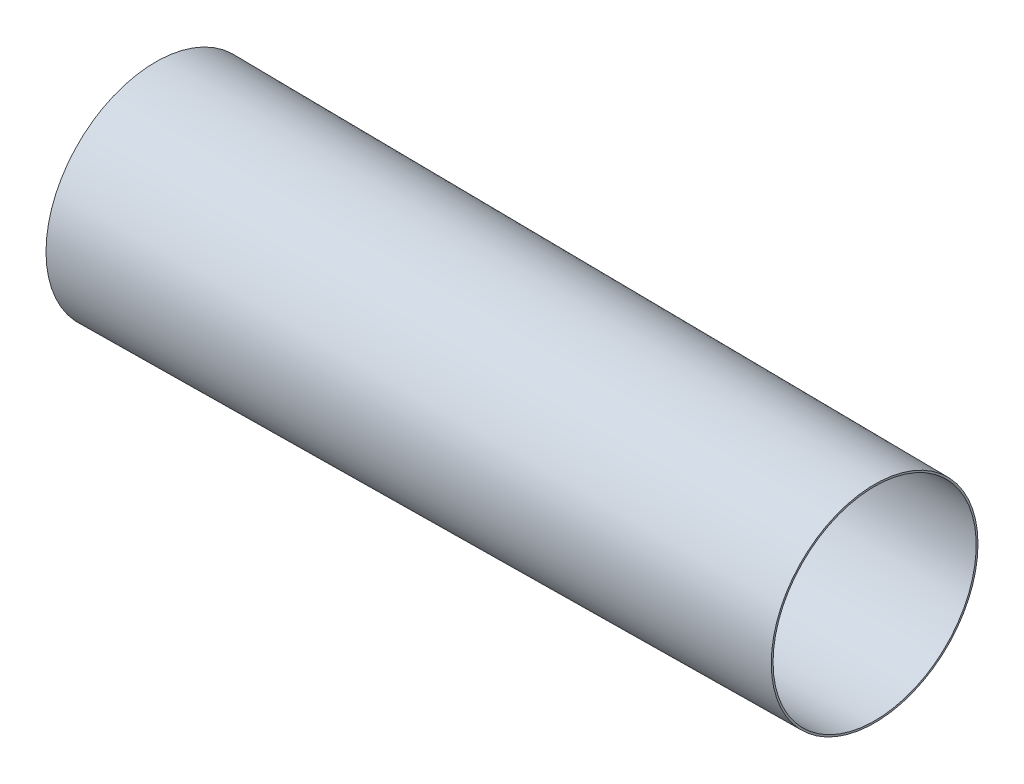
ISO-10303-21;
HEADER;
FILE_DESCRIPTION(('STEP AP214'),'2;1');
FILE_NAME('part.step','',(''),(''),'','','');
FILE_SCHEMA(('AUTOMOTIVE_DESIGN { 1 0 10303 214 1 1 1 1 }'));
ENDSEC;
DATA;
#1=APPLICATION_CONTEXT('core data for automotive mechanical design processes');
#2=APPLICATION_PROTOCOL_DEFINITION('international standard','automotive_design',2000,#1);
#3=PRODUCT_CONTEXT('',#1,'mechanical');
#4=PRODUCT('Part','Part','',(#3));
#5=PRODUCT_RELATED_PRODUCT_CATEGORY('part','',(#4));
#6=PRODUCT_DEFINITION_FORMATION('','',#4);
#7=PRODUCT_DEFINITION_CONTEXT('part definition',#1,'design');
#8=PRODUCT_DEFINITION('design','',#6,#7);
#9=PRODUCT_DEFINITION_SHAPE('','',#8);
#10=(LENGTH_UNIT() NAMED_UNIT(*) SI_UNIT(.MILLI.,.METRE.));
#11=(NAMED_UNIT(*) PLANE_ANGLE_UNIT() SI_UNIT($,.RADIAN.));
#12=(NAMED_UNIT(*) SI_UNIT($,.STERADIAN.) SOLID_ANGLE_UNIT());
#13=UNCERTAINTY_MEASURE_WITH_UNIT(LENGTH_MEASURE(1.E-05),#10,'distance_accuracy_value','');
#14=(GEOMETRIC_REPRESENTATION_CONTEXT(3) GLOBAL_UNCERTAINTY_ASSIGNED_CONTEXT((#13)) GLOBAL_UNIT_ASSIGNED_CONTEXT((#10,
#11,#12)) REPRESENTATION_CONTEXT('',''));
#15=CARTESIAN_POINT('',(0.,0.,0.));
#16=DIRECTION('',(0.,0.,1.));
#17=DIRECTION('',(1.,0.,0.));
#18=AXIS2_PLACEMENT_3D('',#15,#16,#17);
#19=CARTESIAN_POINT('',(0.,0.,-61.));
#20=DIRECTION('',(1.,0.,0.));
#21=DIRECTION('',(0.,0.,-1.));
#22=AXIS2_PLACEMENT_3D('',#19,#20,#21);
#23=PLANE('',#22);
#24=CARTESIAN_POINT('',(0.,0.,0.));
#25=DIRECTION('',(-1.,0.,0.));
#26=DIRECTION('',(0.,0.,1.));
#27=AXIS2_PLACEMENT_3D('',#24,#25,#26);
#28=CIRCLE('',#27,60.);
#29=CARTESIAN_POINT('',(0.,0.,60.));
#30=VERTEX_POINT('',#29);
#31=EDGE_CURVE('E12',#30,#30,#28,.T.);
#32=ORIENTED_EDGE('',*,*,#31,.F.);
#33=EDGE_LOOP('',(#32));
#34=FACE_BOUND('',#33,.T.);
#35=CARTESIAN_POINT('',(0.,0.,0.));
#36=DIRECTION('',(-1.,0.,0.));
#37=DIRECTION('',(0.,0.,1.));
#38=AXIS2_PLACEMENT_3D('',#35,#36,#37);
#39=CIRCLE('',#38,61.);
#40=CARTESIAN_POINT('',(0.,0.,61.));
#41=VERTEX_POINT('',#40);
#42=EDGE_CURVE('E66',#41,#41,#39,.T.);
#43=ORIENTED_EDGE('',*,*,#42,.T.);
#44=EDGE_LOOP('',(#43));
#45=FACE_BOUND('',#44,.T.);
#46=ADVANCED_FACE('F49',(#34,#45),#23,.F.);
#47=CARTESIAN_POINT('',(0.,0.,0.));
#48=DIRECTION('',(-1.,0.,0.));
#49=DIRECTION('',(0.,0.,1.));
#50=AXIS2_PLACEMENT_3D('',#47,#48,#49);
#51=CONICAL_SURFACE('',#50,60.,0.00872664625997478);
#52=CARTESIAN_POINT('',(400.,0.,0.));
#53=DIRECTION('',(-1.,0.,0.));
#54=DIRECTION('',(0.,0.,1.));
#55=AXIS2_PLACEMENT_3D('',#52,#53,#54);
#56=CIRCLE('',#55,56.5092528836952);
#57=CARTESIAN_POINT('',(400.,0.,56.5092528836952));
#58=VERTEX_POINT('',#57);
#59=EDGE_CURVE('E56',#58,#58,#56,.T.);
#60=ORIENTED_EDGE('',*,*,#59,.F.);
#61=EDGE_LOOP('',(#60));
#62=FACE_BOUND('',#61,.T.);
#63=ORIENTED_EDGE('',*,*,#31,.T.);
#64=EDGE_LOOP('',(#63));
#65=FACE_BOUND('',#64,.T.);
#66=ADVANCED_FACE('F82',(#62,#65),#51,.F.);
#67=CARTESIAN_POINT('',(400.,0.,-56.5092528836952));
#68=DIRECTION('',(-1.,0.,0.));
#69=DIRECTION('',(0.,0.,1.));
#70=AXIS2_PLACEMENT_3D('',#67,#68,#69);
#71=PLANE('',#70);
#72=CARTESIAN_POINT('',(400.,0.,0.));
#73=DIRECTION('',(-1.,0.,0.));
#74=DIRECTION('',(0.,0.,1.));
#75=AXIS2_PLACEMENT_3D('',#72,#73,#74);
#76=CIRCLE('',#75,57.5092528836953);
#77=CARTESIAN_POINT('',(400.,0.,57.5092528836953));
#78=VERTEX_POINT('',#77);
#79=EDGE_CURVE('E61',#78,#78,#76,.T.);
#80=ORIENTED_EDGE('',*,*,#79,.F.);
#81=EDGE_LOOP('',(#80));
#82=FACE_BOUND('',#81,.T.);
#83=ORIENTED_EDGE('',*,*,#59,.T.);
#84=EDGE_LOOP('',(#83));
#85=FACE_BOUND('',#84,.T.);
#86=ADVANCED_FACE('F77',(#82,#85),#71,.F.);
#87=CARTESIAN_POINT('',(400.,0.,0.));
#88=DIRECTION('',(-1.,0.,0.));
#89=DIRECTION('',(0.,0.,1.));
#90=AXIS2_PLACEMENT_3D('',#87,#88,#89);
#91=CONICAL_SURFACE('',#90,57.5092528836953,0.00872664625997465);
#92=ORIENTED_EDGE('',*,*,#42,.F.);
#93=EDGE_LOOP('',(#92));
#94=FACE_BOUND('',#93,.T.);
#95=ORIENTED_EDGE('',*,*,#79,.T.);
#96=EDGE_LOOP('',(#95));
#97=FACE_BOUND('',#96,.T.);
#98=ADVANCED_FACE('F74',(#94,#97),#91,.T.);
#99=CLOSED_SHELL('',(#46,#66,#86,#98));
#100=MANIFOLD_SOLID_BREP('B2',#99);
#101=ADVANCED_BREP_SHAPE_REPRESENTATION('',(#18,#100),#14);
#102=SHAPE_DEFINITION_REPRESENTATION(#9,#101);
ENDSEC;
END-ISO-10303-21;
